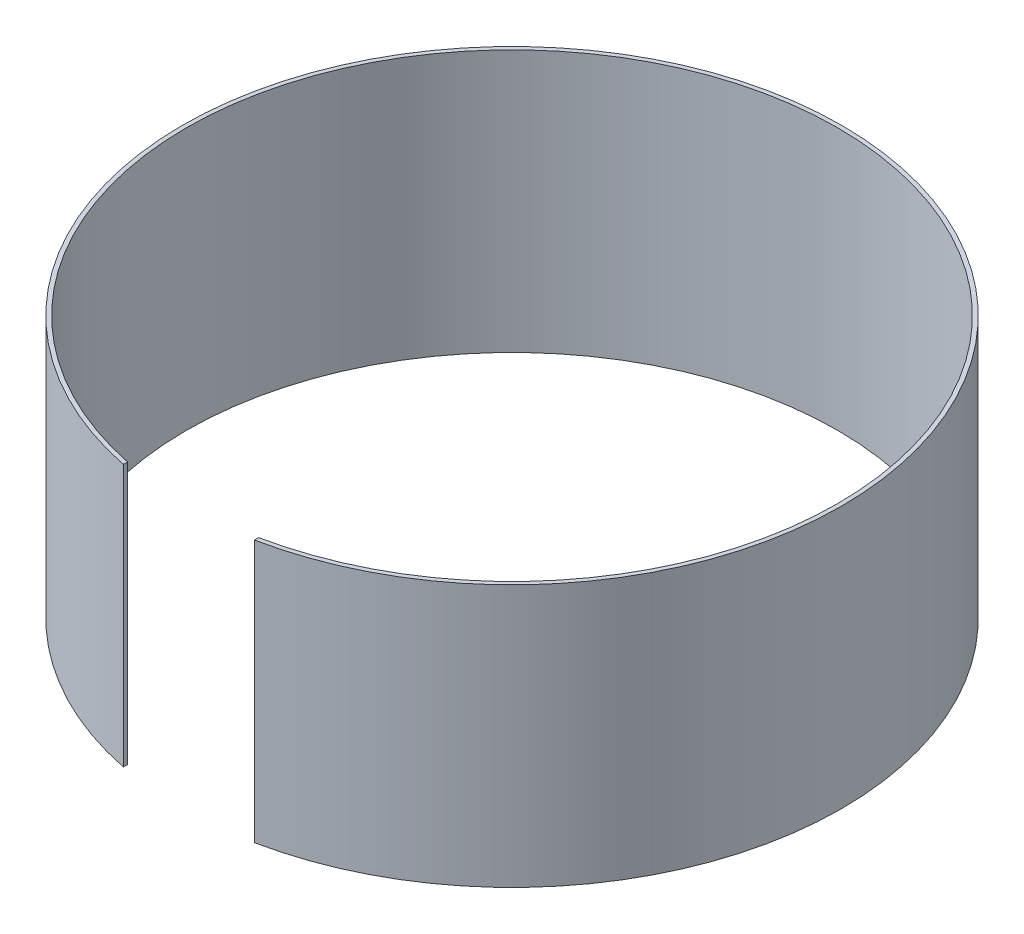
ISO-10303-21;
HEADER;
FILE_DESCRIPTION(('STEP AP214'),'2;1');
FILE_NAME('part.step','',(''),(''),'','','');
FILE_SCHEMA(('AUTOMOTIVE_DESIGN { 1 0 10303 214 1 1 1 1 }'));
ENDSEC;
DATA;
#1=APPLICATION_CONTEXT('core data for automotive mechanical design processes');
#2=APPLICATION_PROTOCOL_DEFINITION('international standard','automotive_design',2000,#1);
#3=PRODUCT_CONTEXT('',#1,'mechanical');
#4=PRODUCT('Part','Part','',(#3));
#5=PRODUCT_RELATED_PRODUCT_CATEGORY('part','',(#4));
#6=PRODUCT_DEFINITION_FORMATION('','',#4);
#7=PRODUCT_DEFINITION_CONTEXT('part definition',#1,'design');
#8=PRODUCT_DEFINITION('design','',#6,#7);
#9=PRODUCT_DEFINITION_SHAPE('','',#8);
#10=(LENGTH_UNIT() NAMED_UNIT(*) SI_UNIT(.MILLI.,.METRE.));
#11=(NAMED_UNIT(*) PLANE_ANGLE_UNIT() SI_UNIT($,.RADIAN.));
#12=(NAMED_UNIT(*) SI_UNIT($,.STERADIAN.) SOLID_ANGLE_UNIT());
#13=UNCERTAINTY_MEASURE_WITH_UNIT(LENGTH_MEASURE(1.E-05),#10,'distance_accuracy_value','');
#14=(GEOMETRIC_REPRESENTATION_CONTEXT(3) GLOBAL_UNCERTAINTY_ASSIGNED_CONTEXT((#13)) GLOBAL_UNIT_ASSIGNED_CONTEXT((#10,
#11,#12)) REPRESENTATION_CONTEXT('',''));
#15=CARTESIAN_POINT('',(0.,0.,0.));
#16=DIRECTION('',(0.,0.,1.));
#17=DIRECTION('',(1.,0.,0.));
#18=AXIS2_PLACEMENT_3D('',#15,#16,#17);
#19=CARTESIAN_POINT('',(0.,0.,0.));
#20=DIRECTION('',(0.,1.,0.));
#21=DIRECTION('',(0.,0.,1.));
#22=AXIS2_PLACEMENT_3D('',#19,#20,#21);
#23=CYLINDRICAL_SURFACE('',#22,126.20625);
#24=CARTESIAN_POINT('',(0.,101.6,0.));
#25=DIRECTION('',(0.,1.,0.));
#26=DIRECTION('',(0.,0.,1.));
#27=AXIS2_PLACEMENT_3D('',#24,#25,#26);
#28=CIRCLE('',#27,126.20625);
#29=CARTESIAN_POINT('',(-25.3999999999822,101.6,123.623855056627));
#30=VERTEX_POINT('',#29);
#31=CARTESIAN_POINT('',(25.3999999999822,101.6,123.623855056627));
#32=VERTEX_POINT('',#31);
#33=EDGE_CURVE('E20',#30,#32,#28,.F.);
#34=ORIENTED_EDGE('',*,*,#33,.F.);
#35=DIRECTION('',(0.,1.,0.));
#36=VECTOR('',#35,1.);
#37=CARTESIAN_POINT('',(-25.3999999999822,0.,123.623855056621));
#38=LINE('',#37,#36);
#39=CARTESIAN_POINT('',(-25.3999999999822,0.,123.623855056627));
#40=VERTEX_POINT('',#39);
#41=EDGE_CURVE('E60',#40,#30,#38,.T.);
#42=ORIENTED_EDGE('',*,*,#41,.F.);
#43=CARTESIAN_POINT('',(0.,0.,0.));
#44=DIRECTION('',(0.,1.,0.));
#45=DIRECTION('',(0.,0.,1.));
#46=AXIS2_PLACEMENT_3D('',#43,#44,#45);
#47=CIRCLE('',#46,126.20625);
#48=CARTESIAN_POINT('',(25.3999999999822,0.,123.623855056627));
#49=VERTEX_POINT('',#48);
#50=EDGE_CURVE('E82',#40,#49,#47,.F.);
#51=ORIENTED_EDGE('',*,*,#50,.T.);
#52=DIRECTION('',(0.,1.,0.));
#53=VECTOR('',#52,1.);
#54=CARTESIAN_POINT('',(25.3999999999822,0.,123.623855056621));
#55=LINE('',#54,#53);
#56=EDGE_CURVE('E62',#32,#49,#55,.F.);
#57=ORIENTED_EDGE('',*,*,#56,.F.);
#58=EDGE_LOOP('',(#34,#42,#51,#57));
#59=FACE_BOUND('',#58,.T.);
#60=ADVANCED_FACE('F17',(#59),#23,.F.);
#61=CARTESIAN_POINT('',(-25.3999999999822,0.,125.244091832956));
#62=DIRECTION('',(1.,0.,0.));
#63=DIRECTION('',(0.,0.,-1.));
#64=AXIS2_PLACEMENT_3D('',#61,#62,#63);
#65=PLANE('',#64);
#66=DIRECTION('',(0.,1.,0.));
#67=VECTOR('',#66,1.);
#68=CARTESIAN_POINT('',(-25.3999999999834,0.,125.244091832962));
#69=LINE('',#68,#67);
#70=CARTESIAN_POINT('',(-25.3999999999828,0.,125.244091832962));
#71=VERTEX_POINT('',#70);
#72=CARTESIAN_POINT('',(-25.3999999999828,101.6,125.244091832962));
#73=VERTEX_POINT('',#72);
#74=EDGE_CURVE('E81',#71,#73,#69,.T.);
#75=ORIENTED_EDGE('',*,*,#74,.F.);
#76=DIRECTION('',(0.,0.,1.));
#77=VECTOR('',#76,1.);
#78=CARTESIAN_POINT('',(-25.3999999999822,0.,0.));
#79=LINE('',#78,#77);
#80=EDGE_CURVE('E71',#71,#40,#79,.F.);
#81=ORIENTED_EDGE('',*,*,#80,.T.);
#82=ORIENTED_EDGE('',*,*,#41,.T.);
#83=DIRECTION('',(0.,0.,1.));
#84=VECTOR('',#83,1.);
#85=CARTESIAN_POINT('',(-25.3999999999822,101.6,0.));
#86=LINE('',#85,#84);
#87=EDGE_CURVE('E65',#73,#30,#86,.F.);
#88=ORIENTED_EDGE('',*,*,#87,.F.);
#89=EDGE_LOOP('',(#75,#81,#82,#88));
#90=FACE_BOUND('',#89,.T.);
#91=ADVANCED_FACE('F68',(#90),#65,.T.);
#92=CARTESIAN_POINT('',(0.,101.6,0.));
#93=DIRECTION('',(0.,1.,0.));
#94=DIRECTION('',(0.,0.,1.));
#95=AXIS2_PLACEMENT_3D('',#92,#93,#94);
#96=PLANE('',#95);
#97=DIRECTION('',(0.,0.,1.));
#98=VECTOR('',#97,1.);
#99=CARTESIAN_POINT('',(25.3999999999822,101.6,123.623855056621));
#100=LINE('',#99,#98);
#101=CARTESIAN_POINT('',(25.3999999999828,101.6,125.244091832962));
#102=VERTEX_POINT('',#101);
#103=EDGE_CURVE('E64',#102,#32,#100,.F.);
#104=ORIENTED_EDGE('',*,*,#103,.F.);
#105=CARTESIAN_POINT('',(0.,101.6,0.));
#106=DIRECTION('',(0.,1.,0.));
#107=DIRECTION('',(0.,0.,1.));
#108=AXIS2_PLACEMENT_3D('',#105,#106,#107);
#109=CIRCLE('',#108,127.79375);
#110=EDGE_CURVE('E74',#73,#102,#109,.F.);
#111=ORIENTED_EDGE('',*,*,#110,.F.);
#112=ORIENTED_EDGE('',*,*,#87,.T.);
#113=ORIENTED_EDGE('',*,*,#33,.T.);
#114=EDGE_LOOP('',(#104,#111,#112,#113));
#115=FACE_BOUND('',#114,.T.);
#116=ADVANCED_FACE('F73',(#115),#96,.T.);
#117=CARTESIAN_POINT('',(25.3999999999822,0.,123.623855056621));
#118=DIRECTION('',(-1.,0.,0.));
#119=DIRECTION('',(0.,0.,1.));
#120=AXIS2_PLACEMENT_3D('',#117,#118,#119);
#121=PLANE('',#120);
#122=ORIENTED_EDGE('',*,*,#56,.T.);
#123=DIRECTION('',(0.,0.,1.));
#124=VECTOR('',#123,1.);
#125=CARTESIAN_POINT('',(25.3999999999822,0.,0.));
#126=LINE('',#125,#124);
#127=CARTESIAN_POINT('',(25.3999999999828,0.,125.244091832962));
#128=VERTEX_POINT('',#127);
#129=EDGE_CURVE('E35',#49,#128,#126,.T.);
#130=ORIENTED_EDGE('',*,*,#129,.T.);
#131=DIRECTION('',(0.,1.,0.));
#132=VECTOR('',#131,1.);
#133=CARTESIAN_POINT('',(25.3999999999833,0.,125.244091832962));
#134=LINE('',#133,#132);
#135=EDGE_CURVE('E26',#102,#128,#134,.F.);
#136=ORIENTED_EDGE('',*,*,#135,.F.);
#137=ORIENTED_EDGE('',*,*,#103,.T.);
#138=EDGE_LOOP('',(#122,#130,#136,#137));
#139=FACE_BOUND('',#138,.T.);
#140=ADVANCED_FACE('F89',(#139),#121,.T.);
#141=CARTESIAN_POINT('',(0.,0.,0.));
#142=DIRECTION('',(0.,1.,0.));
#143=DIRECTION('',(0.,0.,1.));
#144=AXIS2_PLACEMENT_3D('',#141,#142,#143);
#145=PLANE('',#144);
#146=ORIENTED_EDGE('',*,*,#50,.F.);
#147=ORIENTED_EDGE('',*,*,#80,.F.);
#148=CARTESIAN_POINT('',(0.,0.,0.));
#149=DIRECTION('',(0.,1.,0.));
#150=DIRECTION('',(0.,0.,1.));
#151=AXIS2_PLACEMENT_3D('',#148,#149,#150);
#152=CIRCLE('',#151,127.79375);
#153=EDGE_CURVE('E11',#128,#71,#152,.T.);
#154=ORIENTED_EDGE('',*,*,#153,.F.);
#155=ORIENTED_EDGE('',*,*,#129,.F.);
#156=EDGE_LOOP('',(#146,#147,#154,#155));
#157=FACE_BOUND('',#156,.T.);
#158=ADVANCED_FACE('F91',(#157),#145,.F.);
#159=CARTESIAN_POINT('',(0.,0.,0.));
#160=DIRECTION('',(0.,1.,0.));
#161=DIRECTION('',(0.,0.,1.));
#162=AXIS2_PLACEMENT_3D('',#159,#160,#161);
#163=CYLINDRICAL_SURFACE('',#162,127.79375);
#164=ORIENTED_EDGE('',*,*,#153,.T.);
#165=ORIENTED_EDGE('',*,*,#74,.T.);
#166=ORIENTED_EDGE('',*,*,#110,.T.);
#167=ORIENTED_EDGE('',*,*,#135,.T.);
#168=EDGE_LOOP('',(#164,#165,#166,#167));
#169=FACE_BOUND('',#168,.T.);
#170=ADVANCED_FACE('F88',(#169),#163,.T.);
#171=CLOSED_SHELL('',(#60,#91,#116,#140,#158,#170));
#172=MANIFOLD_SOLID_BREP('B1',#171);
#173=ADVANCED_BREP_SHAPE_REPRESENTATION('',(#18,#172),#14);
#174=SHAPE_DEFINITION_REPRESENTATION(#9,#173);
ENDSEC;
END-ISO-10303-21;
